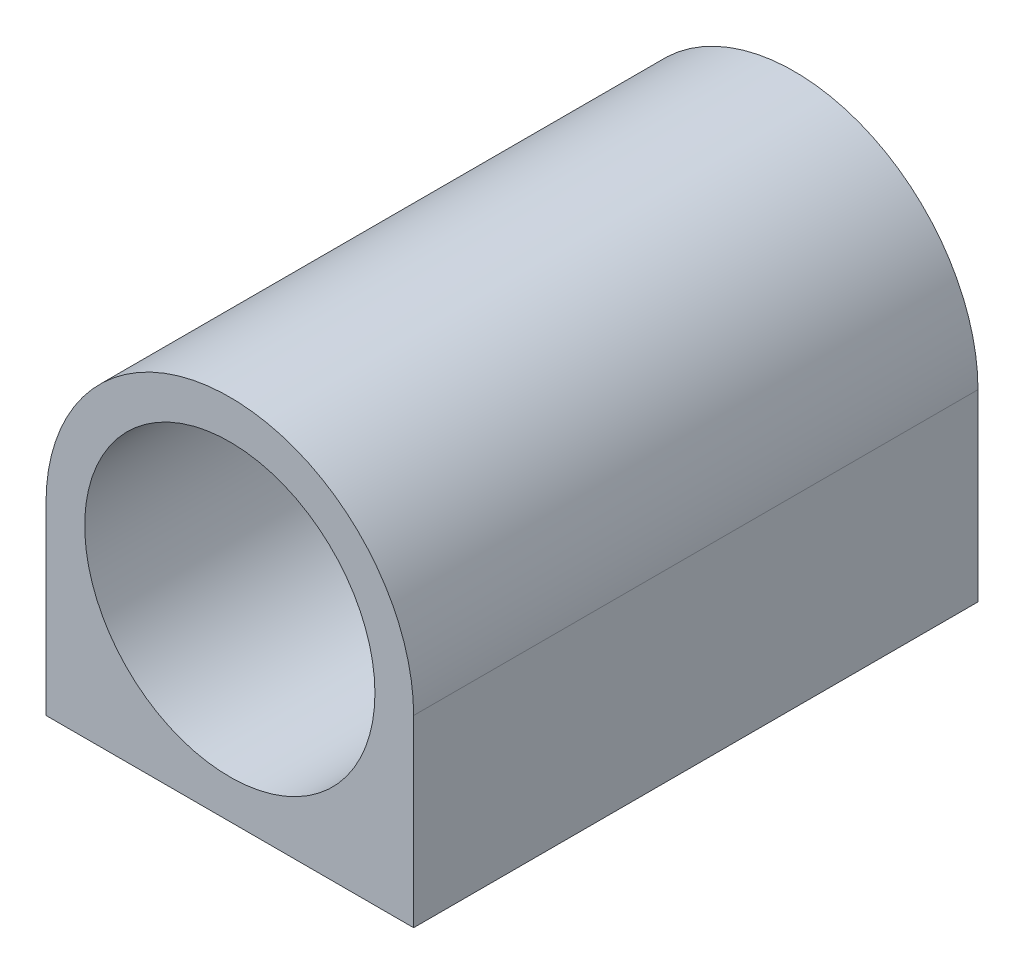
ISO-10303-21;
HEADER;
FILE_DESCRIPTION(('STEP AP214'),'2;1');
FILE_NAME('part.step','',(''),(''),'','','');
FILE_SCHEMA(('AUTOMOTIVE_DESIGN { 1 0 10303 214 1 1 1 1 }'));
ENDSEC;
DATA;
#1=APPLICATION_CONTEXT('core data for automotive mechanical design processes');
#2=APPLICATION_PROTOCOL_DEFINITION('international standard','automotive_design',2000,#1);
#3=PRODUCT_CONTEXT('',#1,'mechanical');
#4=PRODUCT('Part','Part','',(#3));
#5=PRODUCT_RELATED_PRODUCT_CATEGORY('part','',(#4));
#6=PRODUCT_DEFINITION_FORMATION('','',#4);
#7=PRODUCT_DEFINITION_CONTEXT('part definition',#1,'design');
#8=PRODUCT_DEFINITION('design','',#6,#7);
#9=PRODUCT_DEFINITION_SHAPE('','',#8);
#10=(LENGTH_UNIT() NAMED_UNIT(*) SI_UNIT(.MILLI.,.METRE.));
#11=(NAMED_UNIT(*) PLANE_ANGLE_UNIT() SI_UNIT($,.RADIAN.));
#12=(NAMED_UNIT(*) SI_UNIT($,.STERADIAN.) SOLID_ANGLE_UNIT());
#13=UNCERTAINTY_MEASURE_WITH_UNIT(LENGTH_MEASURE(1.E-05),#10,'distance_accuracy_value','');
#14=(GEOMETRIC_REPRESENTATION_CONTEXT(3) GLOBAL_UNCERTAINTY_ASSIGNED_CONTEXT((#13)) GLOBAL_UNIT_ASSIGNED_CONTEXT((#10,
#11,#12)) REPRESENTATION_CONTEXT('',''));
#15=CARTESIAN_POINT('',(0.,0.,0.));
#16=DIRECTION('',(0.,0.,1.));
#17=DIRECTION('',(1.,0.,0.));
#18=AXIS2_PLACEMENT_3D('',#15,#16,#17);
#19=CARTESIAN_POINT('',(11.4,11.4,35.));
#20=DIRECTION('',(0.,0.,1.));
#21=DIRECTION('',(1.,0.,0.));
#22=AXIS2_PLACEMENT_3D('',#19,#20,#21);
#23=PLANE('',#22);
#24=DIRECTION('',(0.,-1.,0.));
#25=VECTOR('',#24,1.);
#26=CARTESIAN_POINT('',(0.,11.4,35.));
#27=LINE('',#26,#25);
#28=CARTESIAN_POINT('',(0.,11.4,35.));
#29=VERTEX_POINT('',#28);
#30=CARTESIAN_POINT('',(0.,0.,35.));
#31=VERTEX_POINT('',#30);
#32=EDGE_CURVE('E91',#29,#31,#27,.T.);
#33=ORIENTED_EDGE('',*,*,#32,.T.);
#34=DIRECTION('',(1.,0.,0.));
#35=VECTOR('',#34,1.);
#36=CARTESIAN_POINT('',(0.,0.,35.));
#37=LINE('',#36,#35);
#38=CARTESIAN_POINT('',(22.8,0.,35.));
#39=VERTEX_POINT('',#38);
#40=EDGE_CURVE('E86',#31,#39,#37,.T.);
#41=ORIENTED_EDGE('',*,*,#40,.T.);
#42=DIRECTION('',(0.,1.,0.));
#43=VECTOR('',#42,1.);
#44=CARTESIAN_POINT('',(22.8,0.,35.));
#45=LINE('',#44,#43);
#46=CARTESIAN_POINT('',(22.8,11.4,35.));
#47=VERTEX_POINT('',#46);
#48=EDGE_CURVE('E89',#39,#47,#45,.T.);
#49=ORIENTED_EDGE('',*,*,#48,.T.);
#50=CARTESIAN_POINT('',(11.4,11.4,35.));
#51=DIRECTION('',(0.,0.,1.));
#52=DIRECTION('',(1.,0.,0.));
#53=AXIS2_PLACEMENT_3D('',#50,#51,#52);
#54=CIRCLE('',#53,11.4);
#55=EDGE_CURVE('E56',#47,#29,#54,.T.);
#56=ORIENTED_EDGE('',*,*,#55,.T.);
#57=EDGE_LOOP('',(#33,#41,#49,#56));
#58=FACE_BOUND('',#57,.T.);
#59=CARTESIAN_POINT('',(11.4,11.4,35.));
#60=DIRECTION('',(0.,0.,1.));
#61=DIRECTION('',(1.,0.,0.));
#62=AXIS2_PLACEMENT_3D('',#59,#60,#61);
#63=CIRCLE('',#62,9.);
#64=CARTESIAN_POINT('',(20.4,11.4,35.));
#65=VERTEX_POINT('',#64);
#66=EDGE_CURVE('E106',#65,#65,#63,.T.);
#67=ORIENTED_EDGE('',*,*,#66,.F.);
#68=EDGE_LOOP('',(#67));
#69=FACE_BOUND('',#68,.T.);
#70=ADVANCED_FACE('F39',(#58,#69),#23,.T.);
#71=CARTESIAN_POINT('',(11.4,11.4,0.));
#72=DIRECTION('',(0.,0.,1.));
#73=DIRECTION('',(1.,0.,0.));
#74=AXIS2_PLACEMENT_3D('',#71,#72,#73);
#75=PLANE('',#74);
#76=DIRECTION('',(0.,-1.,0.));
#77=VECTOR('',#76,1.);
#78=CARTESIAN_POINT('',(0.,11.4,0.));
#79=LINE('',#78,#77);
#80=CARTESIAN_POINT('',(0.,11.4,0.));
#81=VERTEX_POINT('',#80);
#82=CARTESIAN_POINT('',(0.,0.,0.));
#83=VERTEX_POINT('',#82);
#84=EDGE_CURVE('E103',#81,#83,#79,.T.);
#85=ORIENTED_EDGE('',*,*,#84,.F.);
#86=CARTESIAN_POINT('',(11.4,11.4,0.));
#87=DIRECTION('',(0.,0.,1.));
#88=DIRECTION('',(1.,0.,0.));
#89=AXIS2_PLACEMENT_3D('',#86,#87,#88);
#90=CIRCLE('',#89,11.4);
#91=CARTESIAN_POINT('',(22.8,11.4,0.));
#92=VERTEX_POINT('',#91);
#93=EDGE_CURVE('E79',#92,#81,#90,.T.);
#94=ORIENTED_EDGE('',*,*,#93,.F.);
#95=DIRECTION('',(0.,1.,0.));
#96=VECTOR('',#95,1.);
#97=CARTESIAN_POINT('',(22.8,0.,0.));
#98=LINE('',#97,#96);
#99=CARTESIAN_POINT('',(22.8,0.,0.));
#100=VERTEX_POINT('',#99);
#101=EDGE_CURVE('E73',#100,#92,#98,.T.);
#102=ORIENTED_EDGE('',*,*,#101,.F.);
#103=DIRECTION('',(1.,0.,0.));
#104=VECTOR('',#103,1.);
#105=CARTESIAN_POINT('',(0.,0.,0.));
#106=LINE('',#105,#104);
#107=EDGE_CURVE('E95',#83,#100,#106,.T.);
#108=ORIENTED_EDGE('',*,*,#107,.F.);
#109=EDGE_LOOP('',(#85,#94,#102,#108));
#110=FACE_BOUND('',#109,.T.);
#111=CARTESIAN_POINT('',(11.4,11.4,0.));
#112=DIRECTION('',(0.,0.,1.));
#113=DIRECTION('',(1.,0.,0.));
#114=AXIS2_PLACEMENT_3D('',#111,#112,#113);
#115=CIRCLE('',#114,9.);
#116=CARTESIAN_POINT('',(20.4,11.4,0.));
#117=VERTEX_POINT('',#116);
#118=EDGE_CURVE('E118',#117,#117,#115,.T.);
#119=ORIENTED_EDGE('',*,*,#118,.T.);
#120=EDGE_LOOP('',(#119));
#121=FACE_BOUND('',#120,.T.);
#122=ADVANCED_FACE('F114',(#110,#121),#75,.F.);
#123=CARTESIAN_POINT('',(0.,11.4,35.));
#124=DIRECTION('',(1.,0.,0.));
#125=DIRECTION('',(0.,0.,-1.));
#126=AXIS2_PLACEMENT_3D('',#123,#124,#125);
#127=PLANE('',#126);
#128=ORIENTED_EDGE('',*,*,#84,.T.);
#129=DIRECTION('',(0.,0.,-1.));
#130=VECTOR('',#129,1.);
#131=CARTESIAN_POINT('',(0.,0.,35.));
#132=LINE('',#131,#130);
#133=EDGE_CURVE('E11',#31,#83,#132,.T.);
#134=ORIENTED_EDGE('',*,*,#133,.F.);
#135=ORIENTED_EDGE('',*,*,#32,.F.);
#136=DIRECTION('',(0.,0.,-1.));
#137=VECTOR('',#136,1.);
#138=CARTESIAN_POINT('',(0.,11.4,35.));
#139=LINE('',#138,#137);
#140=EDGE_CURVE('E99',#29,#81,#139,.T.);
#141=ORIENTED_EDGE('',*,*,#140,.T.);
#142=EDGE_LOOP('',(#128,#134,#135,#141));
#143=FACE_BOUND('',#142,.T.);
#144=ADVANCED_FACE('F41',(#143),#127,.F.);
#145=CARTESIAN_POINT('',(0.,0.,35.));
#146=DIRECTION('',(0.,1.,0.));
#147=DIRECTION('',(0.,0.,1.));
#148=AXIS2_PLACEMENT_3D('',#145,#146,#147);
#149=PLANE('',#148);
#150=ORIENTED_EDGE('',*,*,#107,.T.);
#151=DIRECTION('',(0.,0.,-1.));
#152=VECTOR('',#151,1.);
#153=CARTESIAN_POINT('',(22.8,0.,35.));
#154=LINE('',#153,#152);
#155=EDGE_CURVE('E48',#39,#100,#154,.T.);
#156=ORIENTED_EDGE('',*,*,#155,.F.);
#157=ORIENTED_EDGE('',*,*,#40,.F.);
#158=ORIENTED_EDGE('',*,*,#133,.T.);
#159=EDGE_LOOP('',(#150,#156,#157,#158));
#160=FACE_BOUND('',#159,.T.);
#161=ADVANCED_FACE('F94',(#160),#149,.F.);
#162=CARTESIAN_POINT('',(22.8,0.,35.));
#163=DIRECTION('',(-1.,0.,0.));
#164=DIRECTION('',(0.,-1.,0.));
#165=AXIS2_PLACEMENT_3D('',#162,#163,#164);
#166=PLANE('',#165);
#167=ORIENTED_EDGE('',*,*,#101,.T.);
#168=DIRECTION('',(0.,0.,-1.));
#169=VECTOR('',#168,1.);
#170=CARTESIAN_POINT('',(22.8,11.4,35.));
#171=LINE('',#170,#169);
#172=EDGE_CURVE('E96',#47,#92,#171,.T.);
#173=ORIENTED_EDGE('',*,*,#172,.F.);
#174=ORIENTED_EDGE('',*,*,#48,.F.);
#175=ORIENTED_EDGE('',*,*,#155,.T.);
#176=EDGE_LOOP('',(#167,#173,#174,#175));
#177=FACE_BOUND('',#176,.T.);
#178=ADVANCED_FACE('F97',(#177),#166,.F.);
#179=CARTESIAN_POINT('',(11.4,11.4,35.));
#180=DIRECTION('',(0.,0.,-1.));
#181=DIRECTION('',(-1.,0.,0.));
#182=AXIS2_PLACEMENT_3D('',#179,#180,#181);
#183=CYLINDRICAL_SURFACE('',#182,11.4);
#184=ORIENTED_EDGE('',*,*,#93,.T.);
#185=ORIENTED_EDGE('',*,*,#140,.F.);
#186=ORIENTED_EDGE('',*,*,#55,.F.);
#187=ORIENTED_EDGE('',*,*,#172,.T.);
#188=EDGE_LOOP('',(#184,#185,#186,#187));
#189=FACE_BOUND('',#188,.T.);
#190=ADVANCED_FACE('F111',(#189),#183,.T.);
#191=CARTESIAN_POINT('',(11.4,11.4,35.));
#192=DIRECTION('',(0.,0.,-1.));
#193=DIRECTION('',(-1.,0.,0.));
#194=AXIS2_PLACEMENT_3D('',#191,#192,#193);
#195=CYLINDRICAL_SURFACE('',#194,9.);
#196=ORIENTED_EDGE('',*,*,#66,.T.);
#197=EDGE_LOOP('',(#196));
#198=FACE_BOUND('',#197,.T.);
#199=ORIENTED_EDGE('',*,*,#118,.F.);
#200=EDGE_LOOP('',(#199));
#201=FACE_BOUND('',#200,.T.);
#202=ADVANCED_FACE('F124',(#198,#201),#195,.F.);
#203=CLOSED_SHELL('',(#70,#122,#144,#161,#178,#190,#202));
#204=MANIFOLD_SOLID_BREP('B2',#203);
#205=ADVANCED_BREP_SHAPE_REPRESENTATION('',(#18,#204),#14);
#206=SHAPE_DEFINITION_REPRESENTATION(#9,#205);
ENDSEC;
END-ISO-10303-21;
